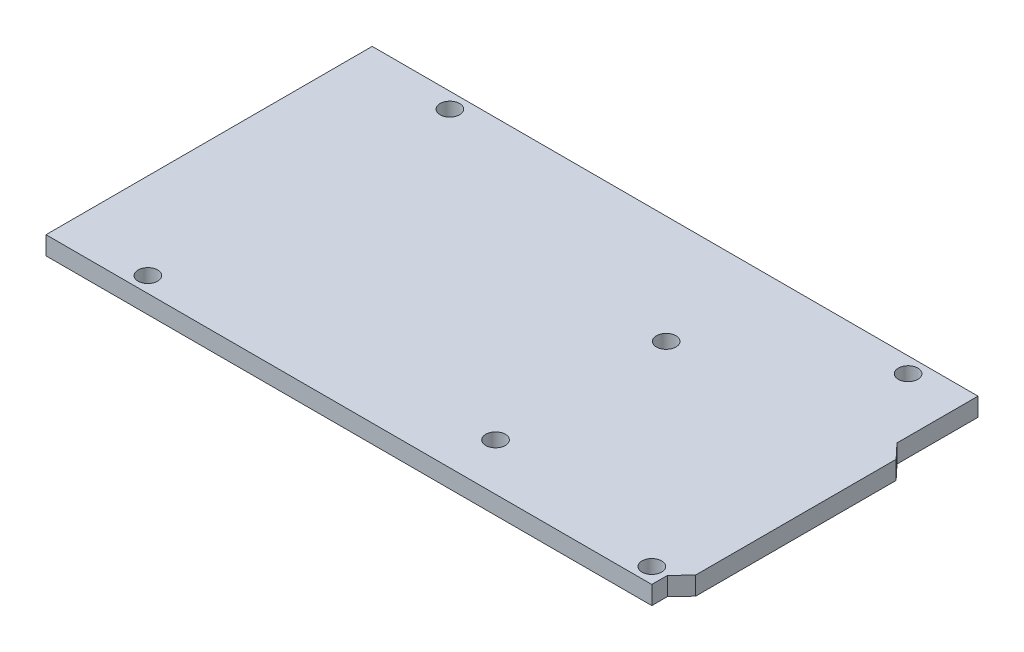
ISO-10303-21;
HEADER;
FILE_DESCRIPTION(('STEP AP214'),'2;1');
FILE_NAME('part.step','',(''),(''),'','','');
FILE_SCHEMA(('AUTOMOTIVE_DESIGN { 1 0 10303 214 1 1 1 1 }'));
ENDSEC;
DATA;
#1=APPLICATION_CONTEXT('core data for automotive mechanical design processes');
#2=APPLICATION_PROTOCOL_DEFINITION('international standard','automotive_design',2000,#1);
#3=PRODUCT_CONTEXT('',#1,'mechanical');
#4=PRODUCT('Part','Part','',(#3));
#5=PRODUCT_RELATED_PRODUCT_CATEGORY('part','',(#4));
#6=PRODUCT_DEFINITION_FORMATION('','',#4);
#7=PRODUCT_DEFINITION_CONTEXT('part definition',#1,'design');
#8=PRODUCT_DEFINITION('design','',#6,#7);
#9=PRODUCT_DEFINITION_SHAPE('','',#8);
#10=(LENGTH_UNIT() NAMED_UNIT(*) SI_UNIT(.MILLI.,.METRE.));
#11=(NAMED_UNIT(*) PLANE_ANGLE_UNIT() SI_UNIT($,.RADIAN.));
#12=(NAMED_UNIT(*) SI_UNIT($,.STERADIAN.) SOLID_ANGLE_UNIT());
#13=UNCERTAINTY_MEASURE_WITH_UNIT(LENGTH_MEASURE(1.E-05),#10,'distance_accuracy_value','');
#14=(GEOMETRIC_REPRESENTATION_CONTEXT(3) GLOBAL_UNCERTAINTY_ASSIGNED_CONTEXT((#13)) GLOBAL_UNIT_ASSIGNED_CONTEXT((#10,
#11,#12)) REPRESENTATION_CONTEXT('',''));
#15=CARTESIAN_POINT('',(0.,0.,0.));
#16=DIRECTION('',(0.,0.,1.));
#17=DIRECTION('',(1.,0.,0.));
#18=AXIS2_PLACEMENT_3D('',#15,#16,#17);
#19=CARTESIAN_POINT('',(0.,3.,0.));
#20=DIRECTION('',(0.,1.,0.));
#21=DIRECTION('',(0.,0.,1.));
#22=AXIS2_PLACEMENT_3D('',#19,#20,#21);
#23=PLANE('',#22);
#24=CARTESIAN_POINT('',(46.99,3.,24.13));
#25=DIRECTION('',(0.,1.,0.));
#26=DIRECTION('',(0.,0.,1.));
#27=AXIS2_PLACEMENT_3D('',#24,#25,#26);
#28=CIRCLE('',#27,1.6);
#29=CARTESIAN_POINT('',(46.99,3.,25.73));
#30=VERTEX_POINT('',#29);
#31=EDGE_CURVE('E237',#30,#30,#28,.T.);
#32=ORIENTED_EDGE('',*,*,#31,.F.);
#33=EDGE_LOOP('',(#32));
#34=FACE_BOUND('',#33,.T.);
#35=CARTESIAN_POINT('',(-35.41,3.,24.13));
#36=DIRECTION('',(0.,1.,0.));
#37=DIRECTION('',(0.,0.,1.));
#38=AXIS2_PLACEMENT_3D('',#35,#36,#37);
#39=CIRCLE('',#38,1.6);
#40=CARTESIAN_POINT('',(-35.41,3.,25.73));
#41=VERTEX_POINT('',#40);
#42=EDGE_CURVE('E221',#41,#41,#39,.T.);
#43=ORIENTED_EDGE('',*,*,#42,.F.);
#44=EDGE_LOOP('',(#43));
#45=FACE_BOUND('',#44,.T.);
#46=CARTESIAN_POINT('',(-34.29,3.,-24.13));
#47=DIRECTION('',(0.,1.,0.));
#48=DIRECTION('',(0.,0.,1.));
#49=AXIS2_PLACEMENT_3D('',#46,#47,#48);
#50=CIRCLE('',#49,1.59932161326274);
#51=CARTESIAN_POINT('',(-34.29,3.,-22.5306783867373));
#52=VERTEX_POINT('',#51);
#53=EDGE_CURVE('E146',#52,#52,#50,.T.);
#54=ORIENTED_EDGE('',*,*,#53,.F.);
#55=EDGE_LOOP('',(#54));
#56=FACE_BOUND('',#55,.T.);
#57=DIRECTION('',(0.,0.,-1.));
#58=VECTOR('',#57,1.);
#59=CARTESIAN_POINT('',(49.53,3.,24.13));
#60=LINE('',#59,#58);
#61=CARTESIAN_POINT('',(49.53,3.,26.67));
#62=VERTEX_POINT('',#61);
#63=CARTESIAN_POINT('',(49.53,3.,24.13));
#64=VERTEX_POINT('',#63);
#65=EDGE_CURVE('E164',#62,#64,#60,.T.);
#66=ORIENTED_EDGE('',*,*,#65,.T.);
#67=DIRECTION('',(0.685459721224409,0.,-0.728110548322819));
#68=VECTOR('',#67,1.);
#69=CARTESIAN_POINT('',(49.53,3.,24.13));
#70=LINE('',#69,#68);
#71=CARTESIAN_POINT('',(51.78,3.,21.74));
#72=VERTEX_POINT('',#71);
#73=EDGE_CURVE('E100',#64,#72,#70,.T.);
#74=ORIENTED_EDGE('',*,*,#73,.T.);
#75=DIRECTION('',(0.,0.,-1.));
#76=VECTOR('',#75,1.);
#77=CARTESIAN_POINT('',(51.78,3.,21.74));
#78=LINE('',#77,#76);
#79=CARTESIAN_POINT('',(51.78,3.,-11.03));
#80=VERTEX_POINT('',#79);
#81=EDGE_CURVE('E185',#72,#80,#78,.T.);
#82=ORIENTED_EDGE('',*,*,#81,.T.);
#83=DIRECTION('',(-0.685459721224409,0.,-0.728110548322818));
#84=VECTOR('',#83,1.);
#85=CARTESIAN_POINT('',(51.78,3.,-11.03));
#86=LINE('',#85,#84);
#87=CARTESIAN_POINT('',(49.53,3.,-13.42));
#88=VERTEX_POINT('',#87);
#89=EDGE_CURVE('E199',#80,#88,#86,.T.);
#90=ORIENTED_EDGE('',*,*,#89,.T.);
#91=DIRECTION('',(0.,0.,-1.));
#92=VECTOR('',#91,1.);
#93=CARTESIAN_POINT('',(49.53,3.,-26.67));
#94=LINE('',#93,#92);
#95=CARTESIAN_POINT('',(49.53,3.,-26.67));
#96=VERTEX_POINT('',#95);
#97=EDGE_CURVE('E119',#88,#96,#94,.T.);
#98=ORIENTED_EDGE('',*,*,#97,.T.);
#99=DIRECTION('',(-1.,0.,0.));
#100=VECTOR('',#99,1.);
#101=CARTESIAN_POINT('',(-49.53,3.,-26.67));
#102=LINE('',#101,#100);
#103=CARTESIAN_POINT('',(-49.53,3.,-26.67));
#104=VERTEX_POINT('',#103);
#105=EDGE_CURVE('E113',#96,#104,#102,.T.);
#106=ORIENTED_EDGE('',*,*,#105,.T.);
#107=DIRECTION('',(0.,0.,1.));
#108=VECTOR('',#107,1.);
#109=CARTESIAN_POINT('',(-49.53,3.,-26.67));
#110=LINE('',#109,#108);
#111=CARTESIAN_POINT('',(-49.53,3.,26.67));
#112=VERTEX_POINT('',#111);
#113=EDGE_CURVE('E117',#104,#112,#110,.T.);
#114=ORIENTED_EDGE('',*,*,#113,.T.);
#115=DIRECTION('',(1.,0.,0.));
#116=VECTOR('',#115,1.);
#117=CARTESIAN_POINT('',(-49.53,3.,26.67));
#118=LINE('',#117,#116);
#119=EDGE_CURVE('E57',#112,#62,#118,.T.);
#120=ORIENTED_EDGE('',*,*,#119,.T.);
#121=EDGE_LOOP('',(#66,#74,#82,#90,#98,#106,#114,#120));
#122=FACE_BOUND('',#121,.T.);
#123=CARTESIAN_POINT('',(40.64,3.,-24.13));
#124=DIRECTION('',(0.,1.,0.));
#125=DIRECTION('',(0.,0.,1.));
#126=AXIS2_PLACEMENT_3D('',#123,#124,#125);
#127=CIRCLE('',#126,1.6);
#128=CARTESIAN_POINT('',(40.64,3.,-22.53));
#129=VERTEX_POINT('',#128);
#130=EDGE_CURVE('E213',#129,#129,#127,.T.);
#131=ORIENTED_EDGE('',*,*,#130,.F.);
#132=EDGE_LOOP('',(#131));
#133=FACE_BOUND('',#132,.T.);
#134=CARTESIAN_POINT('',(16.28,3.,18.97));
#135=DIRECTION('',(0.,1.,0.));
#136=DIRECTION('',(0.,0.,1.));
#137=AXIS2_PLACEMENT_3D('',#134,#135,#136);
#138=CIRCLE('',#137,1.6);
#139=CARTESIAN_POINT('',(16.28,3.,20.57));
#140=VERTEX_POINT('',#139);
#141=EDGE_CURVE('E229',#140,#140,#138,.T.);
#142=ORIENTED_EDGE('',*,*,#141,.F.);
#143=EDGE_LOOP('',(#142));
#144=FACE_BOUND('',#143,.T.);
#145=CARTESIAN_POINT('',(16.28,3.,-8.92999999999999));
#146=DIRECTION('',(0.,1.,0.));
#147=DIRECTION('',(0.,0.,1.));
#148=AXIS2_PLACEMENT_3D('',#145,#146,#147);
#149=CIRCLE('',#148,1.6);
#150=CARTESIAN_POINT('',(16.28,3.,-7.32999999999999));
#151=VERTEX_POINT('',#150);
#152=EDGE_CURVE('E245',#151,#151,#149,.T.);
#153=ORIENTED_EDGE('',*,*,#152,.F.);
#154=EDGE_LOOP('',(#153));
#155=FACE_BOUND('',#154,.T.);
#156=ADVANCED_FACE('F39',(#34,#45,#56,#122,#133,#144,#155),#23,.T.);
#157=CARTESIAN_POINT('',(0.,0.,0.));
#158=DIRECTION('',(0.,1.,0.));
#159=DIRECTION('',(0.,0.,1.));
#160=AXIS2_PLACEMENT_3D('',#157,#158,#159);
#161=PLANE('',#160);
#162=DIRECTION('',(0.,0.,-1.));
#163=VECTOR('',#162,1.);
#164=CARTESIAN_POINT('',(49.53,0.,24.13));
#165=LINE('',#164,#163);
#166=CARTESIAN_POINT('',(49.53,0.,26.67));
#167=VERTEX_POINT('',#166);
#168=CARTESIAN_POINT('',(49.53,0.,24.13));
#169=VERTEX_POINT('',#168);
#170=EDGE_CURVE('E141',#167,#169,#165,.T.);
#171=ORIENTED_EDGE('',*,*,#170,.F.);
#172=DIRECTION('',(1.,0.,0.));
#173=VECTOR('',#172,1.);
#174=CARTESIAN_POINT('',(-49.53,0.,26.67));
#175=LINE('',#174,#173);
#176=CARTESIAN_POINT('',(-49.53,0.,26.67));
#177=VERTEX_POINT('',#176);
#178=EDGE_CURVE('E92',#177,#167,#175,.T.);
#179=ORIENTED_EDGE('',*,*,#178,.F.);
#180=DIRECTION('',(0.,0.,1.));
#181=VECTOR('',#180,1.);
#182=CARTESIAN_POINT('',(-49.53,0.,-26.67));
#183=LINE('',#182,#181);
#184=CARTESIAN_POINT('',(-49.53,0.,-26.67));
#185=VERTEX_POINT('',#184);
#186=EDGE_CURVE('E86',#185,#177,#183,.T.);
#187=ORIENTED_EDGE('',*,*,#186,.F.);
#188=DIRECTION('',(-1.,0.,0.));
#189=VECTOR('',#188,1.);
#190=CARTESIAN_POINT('',(-49.53,0.,-26.67));
#191=LINE('',#190,#189);
#192=CARTESIAN_POINT('',(49.53,0.,-26.67));
#193=VERTEX_POINT('',#192);
#194=EDGE_CURVE('E128',#193,#185,#191,.T.);
#195=ORIENTED_EDGE('',*,*,#194,.F.);
#196=DIRECTION('',(0.,0.,-1.));
#197=VECTOR('',#196,1.);
#198=CARTESIAN_POINT('',(49.53,0.,-26.67));
#199=LINE('',#198,#197);
#200=CARTESIAN_POINT('',(49.53,0.,-13.42));
#201=VERTEX_POINT('',#200);
#202=EDGE_CURVE('E155',#201,#193,#199,.T.);
#203=ORIENTED_EDGE('',*,*,#202,.F.);
#204=DIRECTION('',(-0.685459721224409,0.,-0.728110548322818));
#205=VECTOR('',#204,1.);
#206=CARTESIAN_POINT('',(51.78,0.,-11.03));
#207=LINE('',#206,#205);
#208=CARTESIAN_POINT('',(51.78,0.,-11.03));
#209=VERTEX_POINT('',#208);
#210=EDGE_CURVE('E152',#209,#201,#207,.T.);
#211=ORIENTED_EDGE('',*,*,#210,.F.);
#212=DIRECTION('',(0.,0.,-1.));
#213=VECTOR('',#212,1.);
#214=CARTESIAN_POINT('',(51.78,0.,21.74));
#215=LINE('',#214,#213);
#216=CARTESIAN_POINT('',(51.78,0.,21.74));
#217=VERTEX_POINT('',#216);
#218=EDGE_CURVE('E149',#217,#209,#215,.T.);
#219=ORIENTED_EDGE('',*,*,#218,.F.);
#220=DIRECTION('',(0.685459721224409,0.,-0.728110548322819));
#221=VECTOR('',#220,1.);
#222=CARTESIAN_POINT('',(49.53,0.,24.13));
#223=LINE('',#222,#221);
#224=EDGE_CURVE('E145',#169,#217,#223,.T.);
#225=ORIENTED_EDGE('',*,*,#224,.F.);
#226=EDGE_LOOP('',(#171,#179,#187,#195,#203,#211,#219,#225));
#227=FACE_BOUND('',#226,.T.);
#228=CARTESIAN_POINT('',(-34.29,0.,-24.13));
#229=DIRECTION('',(0.,1.,0.));
#230=DIRECTION('',(0.,0.,1.));
#231=AXIS2_PLACEMENT_3D('',#228,#229,#230);
#232=CIRCLE('',#231,1.59932161326274);
#233=CARTESIAN_POINT('',(-34.29,0.,-22.5306783867373));
#234=VERTEX_POINT('',#233);
#235=EDGE_CURVE('E209',#234,#234,#232,.T.);
#236=ORIENTED_EDGE('',*,*,#235,.T.);
#237=EDGE_LOOP('',(#236));
#238=FACE_BOUND('',#237,.T.);
#239=CARTESIAN_POINT('',(40.64,0.,-24.13));
#240=DIRECTION('',(0.,1.,0.));
#241=DIRECTION('',(0.,0.,1.));
#242=AXIS2_PLACEMENT_3D('',#239,#240,#241);
#243=CIRCLE('',#242,1.6);
#244=CARTESIAN_POINT('',(40.64,0.,-22.53));
#245=VERTEX_POINT('',#244);
#246=EDGE_CURVE('E217',#245,#245,#243,.T.);
#247=ORIENTED_EDGE('',*,*,#246,.T.);
#248=EDGE_LOOP('',(#247));
#249=FACE_BOUND('',#248,.T.);
#250=CARTESIAN_POINT('',(-35.41,0.,24.13));
#251=DIRECTION('',(0.,1.,0.));
#252=DIRECTION('',(0.,0.,1.));
#253=AXIS2_PLACEMENT_3D('',#250,#251,#252);
#254=CIRCLE('',#253,1.6);
#255=CARTESIAN_POINT('',(-35.41,0.,25.73));
#256=VERTEX_POINT('',#255);
#257=EDGE_CURVE('E225',#256,#256,#254,.T.);
#258=ORIENTED_EDGE('',*,*,#257,.T.);
#259=EDGE_LOOP('',(#258));
#260=FACE_BOUND('',#259,.T.);
#261=CARTESIAN_POINT('',(16.28,0.,18.97));
#262=DIRECTION('',(0.,1.,0.));
#263=DIRECTION('',(0.,0.,1.));
#264=AXIS2_PLACEMENT_3D('',#261,#262,#263);
#265=CIRCLE('',#264,1.6);
#266=CARTESIAN_POINT('',(16.28,0.,20.57));
#267=VERTEX_POINT('',#266);
#268=EDGE_CURVE('E233',#267,#267,#265,.T.);
#269=ORIENTED_EDGE('',*,*,#268,.T.);
#270=EDGE_LOOP('',(#269));
#271=FACE_BOUND('',#270,.T.);
#272=CARTESIAN_POINT('',(46.99,0.,24.13));
#273=DIRECTION('',(0.,1.,0.));
#274=DIRECTION('',(0.,0.,1.));
#275=AXIS2_PLACEMENT_3D('',#272,#273,#274);
#276=CIRCLE('',#275,1.6);
#277=CARTESIAN_POINT('',(46.99,0.,25.73));
#278=VERTEX_POINT('',#277);
#279=EDGE_CURVE('E241',#278,#278,#276,.T.);
#280=ORIENTED_EDGE('',*,*,#279,.T.);
#281=EDGE_LOOP('',(#280));
#282=FACE_BOUND('',#281,.T.);
#283=CARTESIAN_POINT('',(16.28,0.,-8.92999999999999));
#284=DIRECTION('',(0.,1.,0.));
#285=DIRECTION('',(0.,0.,1.));
#286=AXIS2_PLACEMENT_3D('',#283,#284,#285);
#287=CIRCLE('',#286,1.6);
#288=CARTESIAN_POINT('',(16.28,0.,-7.32999999999999));
#289=VERTEX_POINT('',#288);
#290=EDGE_CURVE('E249',#289,#289,#287,.T.);
#291=ORIENTED_EDGE('',*,*,#290,.T.);
#292=EDGE_LOOP('',(#291));
#293=FACE_BOUND('',#292,.T.);
#294=ADVANCED_FACE('F189',(#227,#238,#249,#260,#271,#282,#293),#161,.F.);
#295=CARTESIAN_POINT('',(49.53,3.,24.13));
#296=DIRECTION('',(-1.,0.,0.));
#297=DIRECTION('',(0.,0.,1.));
#298=AXIS2_PLACEMENT_3D('',#295,#296,#297);
#299=PLANE('',#298);
#300=ORIENTED_EDGE('',*,*,#170,.T.);
#301=DIRECTION('',(0.,-1.,0.));
#302=VECTOR('',#301,1.);
#303=CARTESIAN_POINT('',(49.53,3.,24.13));
#304=LINE('',#303,#302);
#305=EDGE_CURVE('E11',#64,#169,#304,.T.);
#306=ORIENTED_EDGE('',*,*,#305,.F.);
#307=ORIENTED_EDGE('',*,*,#65,.F.);
#308=DIRECTION('',(0.,-1.,0.));
#309=VECTOR('',#308,1.);
#310=CARTESIAN_POINT('',(49.53,3.,26.67));
#311=LINE('',#310,#309);
#312=EDGE_CURVE('E137',#62,#167,#311,.T.);
#313=ORIENTED_EDGE('',*,*,#312,.T.);
#314=EDGE_LOOP('',(#300,#306,#307,#313));
#315=FACE_BOUND('',#314,.T.);
#316=ADVANCED_FACE('F41',(#315),#299,.F.);
#317=CARTESIAN_POINT('',(49.53,3.,24.13));
#318=DIRECTION('',(-0.728110548322819,0.,-0.685459721224409));
#319=DIRECTION('',(-0.685459721224409,0.,0.728110548322819));
#320=AXIS2_PLACEMENT_3D('',#317,#318,#319);
#321=PLANE('',#320);
#322=ORIENTED_EDGE('',*,*,#224,.T.);
#323=DIRECTION('',(0.,-1.,0.));
#324=VECTOR('',#323,1.);
#325=CARTESIAN_POINT('',(51.78,3.,21.74));
#326=LINE('',#325,#324);
#327=EDGE_CURVE('E49',#72,#217,#326,.T.);
#328=ORIENTED_EDGE('',*,*,#327,.F.);
#329=ORIENTED_EDGE('',*,*,#73,.F.);
#330=ORIENTED_EDGE('',*,*,#305,.T.);
#331=EDGE_LOOP('',(#322,#328,#329,#330));
#332=FACE_BOUND('',#331,.T.);
#333=ADVANCED_FACE('F285',(#332),#321,.F.);
#334=CARTESIAN_POINT('',(51.78,3.,21.74));
#335=DIRECTION('',(-1.,0.,0.));
#336=DIRECTION('',(0.,0.,1.));
#337=AXIS2_PLACEMENT_3D('',#334,#335,#336);
#338=PLANE('',#337);
#339=ORIENTED_EDGE('',*,*,#218,.T.);
#340=DIRECTION('',(0.,-1.,0.));
#341=VECTOR('',#340,1.);
#342=CARTESIAN_POINT('',(51.78,3.,-11.03));
#343=LINE('',#342,#341);
#344=EDGE_CURVE('E175',#80,#209,#343,.T.);
#345=ORIENTED_EDGE('',*,*,#344,.F.);
#346=ORIENTED_EDGE('',*,*,#81,.F.);
#347=ORIENTED_EDGE('',*,*,#327,.T.);
#348=EDGE_LOOP('',(#339,#345,#346,#347));
#349=FACE_BOUND('',#348,.T.);
#350=ADVANCED_FACE('F183',(#349),#338,.F.);
#351=CARTESIAN_POINT('',(51.78,3.,-11.03));
#352=DIRECTION('',(-0.728110548322819,0.,0.685459721224409));
#353=DIRECTION('',(0.685459721224409,0.,0.728110548322818));
#354=AXIS2_PLACEMENT_3D('',#351,#352,#353);
#355=PLANE('',#354);
#356=ORIENTED_EDGE('',*,*,#210,.T.);
#357=DIRECTION('',(0.,-1.,0.));
#358=VECTOR('',#357,1.);
#359=CARTESIAN_POINT('',(49.53,3.,-13.42));
#360=LINE('',#359,#358);
#361=EDGE_CURVE('E171',#88,#201,#360,.T.);
#362=ORIENTED_EDGE('',*,*,#361,.F.);
#363=ORIENTED_EDGE('',*,*,#89,.F.);
#364=ORIENTED_EDGE('',*,*,#344,.T.);
#365=EDGE_LOOP('',(#356,#362,#363,#364));
#366=FACE_BOUND('',#365,.T.);
#367=ADVANCED_FACE('F194',(#366),#355,.F.);
#368=CARTESIAN_POINT('',(49.53,3.,-26.67));
#369=DIRECTION('',(-1.,0.,0.));
#370=DIRECTION('',(0.,0.,1.));
#371=AXIS2_PLACEMENT_3D('',#368,#369,#370);
#372=PLANE('',#371);
#373=ORIENTED_EDGE('',*,*,#202,.T.);
#374=DIRECTION('',(0.,-1.,0.));
#375=VECTOR('',#374,1.);
#376=CARTESIAN_POINT('',(49.53,3.,-26.67));
#377=LINE('',#376,#375);
#378=EDGE_CURVE('E130',#96,#193,#377,.T.);
#379=ORIENTED_EDGE('',*,*,#378,.F.);
#380=ORIENTED_EDGE('',*,*,#97,.F.);
#381=ORIENTED_EDGE('',*,*,#361,.T.);
#382=EDGE_LOOP('',(#373,#379,#380,#381));
#383=FACE_BOUND('',#382,.T.);
#384=ADVANCED_FACE('F197',(#383),#372,.F.);
#385=CARTESIAN_POINT('',(-49.53,3.,-26.67));
#386=DIRECTION('',(0.,0.,1.));
#387=DIRECTION('',(1.,0.,0.));
#388=AXIS2_PLACEMENT_3D('',#385,#386,#387);
#389=PLANE('',#388);
#390=ORIENTED_EDGE('',*,*,#194,.T.);
#391=DIRECTION('',(0.,-1.,0.));
#392=VECTOR('',#391,1.);
#393=CARTESIAN_POINT('',(-49.53,3.,-26.67));
#394=LINE('',#393,#392);
#395=EDGE_CURVE('E125',#104,#185,#394,.T.);
#396=ORIENTED_EDGE('',*,*,#395,.F.);
#397=ORIENTED_EDGE('',*,*,#105,.F.);
#398=ORIENTED_EDGE('',*,*,#378,.T.);
#399=EDGE_LOOP('',(#390,#396,#397,#398));
#400=FACE_BOUND('',#399,.T.);
#401=ADVANCED_FACE('F126',(#400),#389,.F.);
#402=CARTESIAN_POINT('',(-49.53,3.,-26.67));
#403=DIRECTION('',(1.,0.,0.));
#404=DIRECTION('',(0.,0.,-1.));
#405=AXIS2_PLACEMENT_3D('',#402,#403,#404);
#406=PLANE('',#405);
#407=ORIENTED_EDGE('',*,*,#186,.T.);
#408=DIRECTION('',(0.,-1.,0.));
#409=VECTOR('',#408,1.);
#410=CARTESIAN_POINT('',(-49.53,3.,26.67));
#411=LINE('',#410,#409);
#412=EDGE_CURVE('E131',#112,#177,#411,.T.);
#413=ORIENTED_EDGE('',*,*,#412,.F.);
#414=ORIENTED_EDGE('',*,*,#113,.F.);
#415=ORIENTED_EDGE('',*,*,#395,.T.);
#416=EDGE_LOOP('',(#407,#413,#414,#415));
#417=FACE_BOUND('',#416,.T.);
#418=ADVANCED_FACE('F133',(#417),#406,.F.);
#419=CARTESIAN_POINT('',(-49.53,3.,26.67));
#420=DIRECTION('',(0.,0.,-1.));
#421=DIRECTION('',(-1.,0.,0.));
#422=AXIS2_PLACEMENT_3D('',#419,#420,#421);
#423=PLANE('',#422);
#424=ORIENTED_EDGE('',*,*,#178,.T.);
#425=ORIENTED_EDGE('',*,*,#312,.F.);
#426=ORIENTED_EDGE('',*,*,#119,.F.);
#427=ORIENTED_EDGE('',*,*,#412,.T.);
#428=EDGE_LOOP('',(#424,#425,#426,#427));
#429=FACE_BOUND('',#428,.T.);
#430=ADVANCED_FACE('F273',(#429),#423,.F.);
#431=CARTESIAN_POINT('',(-34.29,3.,-24.13));
#432=DIRECTION('',(0.,-1.,0.));
#433=DIRECTION('',(0.,0.,-1.));
#434=AXIS2_PLACEMENT_3D('',#431,#432,#433);
#435=CYLINDRICAL_SURFACE('',#434,1.59932161326274);
#436=ORIENTED_EDGE('',*,*,#53,.T.);
#437=EDGE_LOOP('',(#436));
#438=FACE_BOUND('',#437,.T.);
#439=ORIENTED_EDGE('',*,*,#235,.F.);
#440=EDGE_LOOP('',(#439));
#441=FACE_BOUND('',#440,.T.);
#442=ADVANCED_FACE('F270',(#438,#441),#435,.F.);
#443=CARTESIAN_POINT('',(40.64,3.,-24.13));
#444=DIRECTION('',(0.,-1.,0.));
#445=DIRECTION('',(0.,0.,-1.));
#446=AXIS2_PLACEMENT_3D('',#443,#444,#445);
#447=CYLINDRICAL_SURFACE('',#446,1.6);
#448=ORIENTED_EDGE('',*,*,#130,.T.);
#449=EDGE_LOOP('',(#448));
#450=FACE_BOUND('',#449,.T.);
#451=ORIENTED_EDGE('',*,*,#246,.F.);
#452=EDGE_LOOP('',(#451));
#453=FACE_BOUND('',#452,.T.);
#454=ADVANCED_FACE('F349',(#450,#453),#447,.F.);
#455=CARTESIAN_POINT('',(-35.41,3.,24.13));
#456=DIRECTION('',(0.,-1.,0.));
#457=DIRECTION('',(0.,0.,-1.));
#458=AXIS2_PLACEMENT_3D('',#455,#456,#457);
#459=CYLINDRICAL_SURFACE('',#458,1.6);
#460=ORIENTED_EDGE('',*,*,#42,.T.);
#461=EDGE_LOOP('',(#460));
#462=FACE_BOUND('',#461,.T.);
#463=ORIENTED_EDGE('',*,*,#257,.F.);
#464=EDGE_LOOP('',(#463));
#465=FACE_BOUND('',#464,.T.);
#466=ADVANCED_FACE('F357',(#462,#465),#459,.F.);
#467=CARTESIAN_POINT('',(16.28,3.,18.97));
#468=DIRECTION('',(0.,-1.,0.));
#469=DIRECTION('',(0.,0.,-1.));
#470=AXIS2_PLACEMENT_3D('',#467,#468,#469);
#471=CYLINDRICAL_SURFACE('',#470,1.6);
#472=ORIENTED_EDGE('',*,*,#141,.T.);
#473=EDGE_LOOP('',(#472));
#474=FACE_BOUND('',#473,.T.);
#475=ORIENTED_EDGE('',*,*,#268,.F.);
#476=EDGE_LOOP('',(#475));
#477=FACE_BOUND('',#476,.T.);
#478=ADVANCED_FACE('F365',(#474,#477),#471,.F.);
#479=CARTESIAN_POINT('',(46.99,3.,24.13));
#480=DIRECTION('',(0.,-1.,0.));
#481=DIRECTION('',(0.,0.,-1.));
#482=AXIS2_PLACEMENT_3D('',#479,#480,#481);
#483=CYLINDRICAL_SURFACE('',#482,1.6);
#484=ORIENTED_EDGE('',*,*,#31,.T.);
#485=EDGE_LOOP('',(#484));
#486=FACE_BOUND('',#485,.T.);
#487=ORIENTED_EDGE('',*,*,#279,.F.);
#488=EDGE_LOOP('',(#487));
#489=FACE_BOUND('',#488,.T.);
#490=ADVANCED_FACE('F374',(#486,#489),#483,.F.);
#491=CARTESIAN_POINT('',(16.28,3.,-8.92999999999999));
#492=DIRECTION('',(0.,-1.,0.));
#493=DIRECTION('',(0.,0.,-1.));
#494=AXIS2_PLACEMENT_3D('',#491,#492,#493);
#495=CYLINDRICAL_SURFACE('',#494,1.6);
#496=ORIENTED_EDGE('',*,*,#152,.T.);
#497=EDGE_LOOP('',(#496));
#498=FACE_BOUND('',#497,.T.);
#499=ORIENTED_EDGE('',*,*,#290,.F.);
#500=EDGE_LOOP('',(#499));
#501=FACE_BOUND('',#500,.T.);
#502=ADVANCED_FACE('F257',(#498,#501),#495,.F.);
#503=CLOSED_SHELL('',(#156,#294,#316,#333,#350,#367,#384,#401,#418,#430,#442,#454,#466,#478,
#490,#502));
#504=MANIFOLD_SOLID_BREP('B2',#503);
#505=ADVANCED_BREP_SHAPE_REPRESENTATION('',(#18,#504),#14);
#506=SHAPE_DEFINITION_REPRESENTATION(#9,#505);
ENDSEC;
END-ISO-10303-21;
